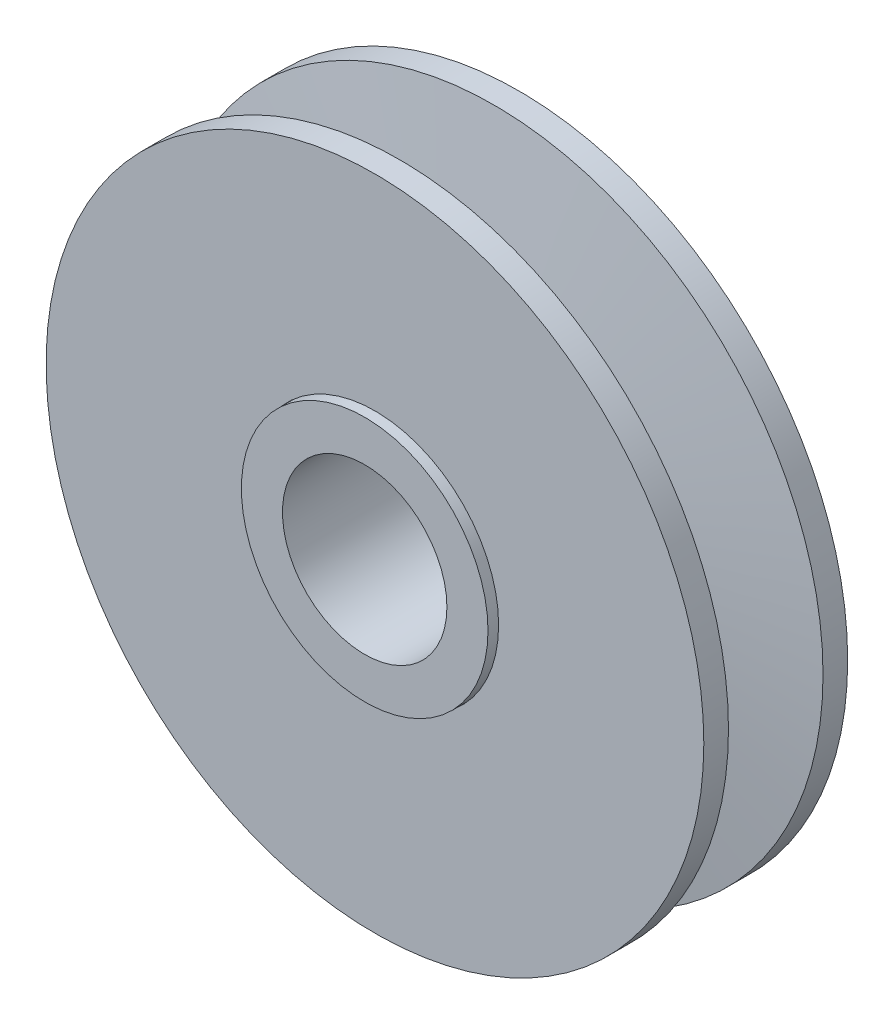
ISO-10303-21;
HEADER;
FILE_DESCRIPTION(('STEP AP214'),'2;1');
FILE_NAME('part.step','',(''),(''),'','','');
FILE_SCHEMA(('AUTOMOTIVE_DESIGN { 1 0 10303 214 1 1 1 1 }'));
ENDSEC;
DATA;
#1=APPLICATION_CONTEXT('core data for automotive mechanical design processes');
#2=APPLICATION_PROTOCOL_DEFINITION('international standard','automotive_design',2000,#1);
#3=PRODUCT_CONTEXT('',#1,'mechanical');
#4=PRODUCT('Part','Part','',(#3));
#5=PRODUCT_RELATED_PRODUCT_CATEGORY('part','',(#4));
#6=PRODUCT_DEFINITION_FORMATION('','',#4);
#7=PRODUCT_DEFINITION_CONTEXT('part definition',#1,'design');
#8=PRODUCT_DEFINITION('design','',#6,#7);
#9=PRODUCT_DEFINITION_SHAPE('','',#8);
#10=(LENGTH_UNIT() NAMED_UNIT(*) SI_UNIT(.MILLI.,.METRE.));
#11=(NAMED_UNIT(*) PLANE_ANGLE_UNIT() SI_UNIT($,.RADIAN.));
#12=(NAMED_UNIT(*) SI_UNIT($,.STERADIAN.) SOLID_ANGLE_UNIT());
#13=UNCERTAINTY_MEASURE_WITH_UNIT(LENGTH_MEASURE(1.E-05),#10,'distance_accuracy_value','');
#14=(GEOMETRIC_REPRESENTATION_CONTEXT(3) GLOBAL_UNCERTAINTY_ASSIGNED_CONTEXT((#13)) GLOBAL_UNIT_ASSIGNED_CONTEXT((#10,
#11,#12)) REPRESENTATION_CONTEXT('',''));
#15=CARTESIAN_POINT('',(0.,0.,0.));
#16=DIRECTION('',(0.,0.,1.));
#17=DIRECTION('',(1.,0.,0.));
#18=AXIS2_PLACEMENT_3D('',#15,#16,#17);
#19=CARTESIAN_POINT('',(0.,0.,0.));
#20=DIRECTION('',(0.,0.,1.));
#21=DIRECTION('',(1.,0.,0.));
#22=AXIS2_PLACEMENT_3D('',#19,#20,#21);
#23=TOROIDAL_SURFACE('',#22,15.08125,2.38125);
#24=CARTESIAN_POINT('',(0.,0.,2.36389900894278));
#25=DIRECTION('',(0.,0.,1.));
#26=DIRECTION('',(1.,0.,0.));
#27=AXIS2_PLACEMENT_3D('',#24,#25,#26);
#28=CIRCLE('',#27,14.7943126583741);
#29=CARTESIAN_POINT('',(14.7943126583741,0.,2.36389900894278));
#30=VERTEX_POINT('',#29);
#31=EDGE_CURVE('E68',#30,#30,#28,.T.);
#32=ORIENTED_EDGE('',*,*,#31,.F.);
#33=EDGE_LOOP('',(#32));
#34=FACE_BOUND('',#33,.T.);
#35=CARTESIAN_POINT('',(0.,0.,-2.36389900894278));
#36=DIRECTION('',(0.,0.,1.));
#37=DIRECTION('',(1.,0.,0.));
#38=AXIS2_PLACEMENT_3D('',#35,#36,#37);
#39=CIRCLE('',#38,14.7943126583741);
#40=CARTESIAN_POINT('',(14.7943126583741,0.,-2.36389900894278));
#41=VERTEX_POINT('',#40);
#42=EDGE_CURVE('E66',#41,#41,#39,.T.);
#43=ORIENTED_EDGE('',*,*,#42,.T.);
#44=EDGE_LOOP('',(#43));
#45=FACE_BOUND('',#44,.T.);
#46=ADVANCED_FACE('F50',(#34,#45),#23,.F.);
#47=CARTESIAN_POINT('',(0.,0.,2.36389900894278));
#48=DIRECTION('',(0.,0.,1.));
#49=DIRECTION('',(1.,0.,0.));
#50=AXIS2_PLACEMENT_3D('',#47,#48,#49);
#51=CONICAL_SURFACE('',#50,14.7943126583741,1.45000417866102);
#52=CARTESIAN_POINT('',(0.,0.,3.65125));
#53=DIRECTION('',(0.,0.,1.));
#54=DIRECTION('',(1.,0.,0.));
#55=AXIS2_PLACEMENT_3D('',#52,#53,#54);
#56=CIRCLE('',#55,25.4);
#57=CARTESIAN_POINT('',(25.4,0.,3.65125));
#58=VERTEX_POINT('',#57);
#59=EDGE_CURVE('E72',#58,#58,#56,.T.);
#60=ORIENTED_EDGE('',*,*,#59,.F.);
#61=EDGE_LOOP('',(#60));
#62=FACE_BOUND('',#61,.T.);
#63=ORIENTED_EDGE('',*,*,#31,.T.);
#64=EDGE_LOOP('',(#63));
#65=FACE_BOUND('',#64,.T.);
#66=ADVANCED_FACE('F99',(#62,#65),#51,.T.);
#67=CARTESIAN_POINT('',(0.,0.,6.35));
#68=DIRECTION('',(0.,0.,1.));
#69=DIRECTION('',(1.,0.,0.));
#70=AXIS2_PLACEMENT_3D('',#67,#68,#69);
#71=CYLINDRICAL_SURFACE('',#70,25.4);
#72=CARTESIAN_POINT('',(0.,0.,5.55625));
#73=DIRECTION('',(0.,0.,1.));
#74=DIRECTION('',(1.,0.,0.));
#75=AXIS2_PLACEMENT_3D('',#72,#73,#74);
#76=CIRCLE('',#75,25.4);
#77=CARTESIAN_POINT('',(25.4,0.,5.55625));
#78=VERTEX_POINT('',#77);
#79=EDGE_CURVE('E79',#78,#78,#76,.T.);
#80=ORIENTED_EDGE('',*,*,#79,.F.);
#81=EDGE_LOOP('',(#80));
#82=FACE_BOUND('',#81,.T.);
#83=ORIENTED_EDGE('',*,*,#59,.T.);
#84=EDGE_LOOP('',(#83));
#85=FACE_BOUND('',#84,.T.);
#86=ADVANCED_FACE('F105',(#82,#85),#71,.T.);
#87=CARTESIAN_POINT('',(0.,9.525,5.55625));
#88=DIRECTION('',(0.,0.,-1.));
#89=DIRECTION('',(-1.,0.,0.));
#90=AXIS2_PLACEMENT_3D('',#87,#88,#89);
#91=PLANE('',#90);
#92=CARTESIAN_POINT('',(0.,0.,5.55625));
#93=DIRECTION('',(0.,0.,-1.));
#94=DIRECTION('',(-1.,0.,0.));
#95=AXIS2_PLACEMENT_3D('',#92,#93,#94);
#96=CIRCLE('',#95,9.5504);
#97=CARTESIAN_POINT('',(9.5504,0.,5.55625));
#98=VERTEX_POINT('',#97);
#99=EDGE_CURVE('E54',#98,#98,#96,.T.);
#100=ORIENTED_EDGE('',*,*,#99,.T.);
#101=EDGE_LOOP('',(#100));
#102=FACE_BOUND('',#101,.T.);
#103=ORIENTED_EDGE('',*,*,#79,.T.);
#104=EDGE_LOOP('',(#103));
#105=FACE_BOUND('',#104,.T.);
#106=ADVANCED_FACE('F87',(#102,#105),#91,.F.);
#107=CARTESIAN_POINT('',(0.,25.4,-5.55625));
#108=DIRECTION('',(0.,0.,1.));
#109=DIRECTION('',(1.,0.,0.));
#110=AXIS2_PLACEMENT_3D('',#107,#108,#109);
#111=PLANE('',#110);
#112=CARTESIAN_POINT('',(0.,0.,-5.55625));
#113=DIRECTION('',(0.,0.,1.));
#114=DIRECTION('',(1.,0.,0.));
#115=AXIS2_PLACEMENT_3D('',#112,#113,#114);
#116=CIRCLE('',#115,9.5504);
#117=CARTESIAN_POINT('',(9.5504,0.,-5.55625));
#118=VERTEX_POINT('',#117);
#119=EDGE_CURVE('E63',#118,#118,#116,.T.);
#120=ORIENTED_EDGE('',*,*,#119,.T.);
#121=EDGE_LOOP('',(#120));
#122=FACE_BOUND('',#121,.T.);
#123=CARTESIAN_POINT('',(0.,0.,-5.55625));
#124=DIRECTION('',(0.,0.,1.));
#125=DIRECTION('',(1.,0.,0.));
#126=AXIS2_PLACEMENT_3D('',#123,#124,#125);
#127=CIRCLE('',#126,25.4);
#128=CARTESIAN_POINT('',(25.4,0.,-5.55625));
#129=VERTEX_POINT('',#128);
#130=EDGE_CURVE('E58',#129,#129,#127,.T.);
#131=ORIENTED_EDGE('',*,*,#130,.F.);
#132=EDGE_LOOP('',(#131));
#133=FACE_BOUND('',#132,.T.);
#134=ADVANCED_FACE('F114',(#122,#133),#111,.F.);
#135=CARTESIAN_POINT('',(0.,0.,6.35));
#136=DIRECTION('',(0.,0.,1.));
#137=DIRECTION('',(1.,0.,0.));
#138=AXIS2_PLACEMENT_3D('',#135,#136,#137);
#139=CYLINDRICAL_SURFACE('',#138,25.4);
#140=CARTESIAN_POINT('',(0.,0.,-3.65125));
#141=DIRECTION('',(0.,0.,1.));
#142=DIRECTION('',(1.,0.,0.));
#143=AXIS2_PLACEMENT_3D('',#140,#141,#142);
#144=CIRCLE('',#143,25.4);
#145=CARTESIAN_POINT('',(25.4,0.,-3.65125));
#146=VERTEX_POINT('',#145);
#147=EDGE_CURVE('E12',#146,#146,#144,.T.);
#148=ORIENTED_EDGE('',*,*,#147,.F.);
#149=EDGE_LOOP('',(#148));
#150=FACE_BOUND('',#149,.T.);
#151=ORIENTED_EDGE('',*,*,#130,.T.);
#152=EDGE_LOOP('',(#151));
#153=FACE_BOUND('',#152,.T.);
#154=ADVANCED_FACE('F95',(#150,#153),#139,.T.);
#155=CARTESIAN_POINT('',(0.,0.,-3.65125));
#156=DIRECTION('',(0.,0.,-1.));
#157=DIRECTION('',(-1.,0.,0.));
#158=AXIS2_PLACEMENT_3D('',#155,#156,#157);
#159=CONICAL_SURFACE('',#158,25.4,1.45000417866102);
#160=ORIENTED_EDGE('',*,*,#42,.F.);
#161=EDGE_LOOP('',(#160));
#162=FACE_BOUND('',#161,.T.);
#163=ORIENTED_EDGE('',*,*,#147,.T.);
#164=EDGE_LOOP('',(#163));
#165=FACE_BOUND('',#164,.T.);
#166=ADVANCED_FACE('F90',(#162,#165),#159,.T.);
#167=CARTESIAN_POINT('',(0.,0.,-6.35));
#168=DIRECTION('',(0.,0.,1.));
#169=DIRECTION('',(1.,0.,0.));
#170=AXIS2_PLACEMENT_3D('',#167,#168,#169);
#171=CYLINDRICAL_SURFACE('',#170,9.5504);
#172=CARTESIAN_POINT('',(9.5504,0.,-5.55625));
#173=CARTESIAN_POINT('',(9.5504,0.,-5.44049479166667));
#174=CARTESIAN_POINT('',(9.5504,0.,-5.32473958333333));
#175=CARTESIAN_POINT('',(9.5504,0.,-5.09322916666667));
#176=CARTESIAN_POINT('',(9.5504,0.,-4.97747395833333));
#177=CARTESIAN_POINT('',(9.5504,0.,-4.74596354166667));
#178=CARTESIAN_POINT('',(9.5504,0.,-4.63020833333333));
#179=CARTESIAN_POINT('',(9.5504,0.,-4.39869791666667));
#180=CARTESIAN_POINT('',(9.5504,0.,-4.28294270833333));
#181=CARTESIAN_POINT('',(9.5504,0.,-4.05143229166667));
#182=CARTESIAN_POINT('',(9.5504,0.,-3.93567708333333));
#183=CARTESIAN_POINT('',(9.5504,0.,-3.70416666666667));
#184=CARTESIAN_POINT('',(9.5504,0.,-3.58841145833333));
#185=CARTESIAN_POINT('',(9.5504,0.,-3.35690104166667));
#186=CARTESIAN_POINT('',(9.5504,0.,-3.24114583333333));
#187=CARTESIAN_POINT('',(9.5504,0.,-3.00963541666667));
#188=CARTESIAN_POINT('',(9.5504,0.,-2.89388020833333));
#189=CARTESIAN_POINT('',(9.5504,0.,-2.66236979166667));
#190=CARTESIAN_POINT('',(9.5504,0.,-2.54661458333333));
#191=CARTESIAN_POINT('',(9.5504,0.,-2.31510416666667));
#192=CARTESIAN_POINT('',(9.5504,0.,-2.19934895833333));
#193=CARTESIAN_POINT('',(9.5504,0.,-1.96783854166667));
#194=CARTESIAN_POINT('',(9.5504,0.,-1.85208333333333));
#195=CARTESIAN_POINT('',(9.5504,0.,-1.62057291666667));
#196=CARTESIAN_POINT('',(9.5504,0.,-1.50481770833333));
#197=CARTESIAN_POINT('',(9.5504,0.,-1.27330729166667));
#198=CARTESIAN_POINT('',(9.5504,0.,-1.15755208333333));
#199=CARTESIAN_POINT('',(9.5504,0.,-0.926041666666667));
#200=CARTESIAN_POINT('',(9.5504,0.,-0.810286458333333));
#201=CARTESIAN_POINT('',(9.5504,0.,-0.578776041666666));
#202=CARTESIAN_POINT('',(9.5504,0.,-0.463020833333333));
#203=CARTESIAN_POINT('',(9.5504,0.,-0.231510416666666));
#204=CARTESIAN_POINT('',(9.5504,0.,-0.115755208333333));
#205=CARTESIAN_POINT('',(9.5504,0.,0.115755208333334));
#206=CARTESIAN_POINT('',(9.5504,0.,0.231510416666667));
#207=CARTESIAN_POINT('',(9.5504,0.,0.463020833333334));
#208=CARTESIAN_POINT('',(9.5504,0.,0.578776041666667));
#209=CARTESIAN_POINT('',(9.5504,0.,0.810286458333333));
#210=CARTESIAN_POINT('',(9.5504,0.,0.926041666666667));
#211=CARTESIAN_POINT('',(9.5504,0.,1.15755208333333));
#212=CARTESIAN_POINT('',(9.5504,0.,1.27330729166667));
#213=CARTESIAN_POINT('',(9.5504,0.,1.50481770833333));
#214=CARTESIAN_POINT('',(9.5504,0.,1.62057291666667));
#215=CARTESIAN_POINT('',(9.5504,0.,1.85208333333333));
#216=CARTESIAN_POINT('',(9.5504,0.,1.96783854166667));
#217=CARTESIAN_POINT('',(9.5504,0.,2.19934895833333));
#218=CARTESIAN_POINT('',(9.5504,0.,2.31510416666667));
#219=CARTESIAN_POINT('',(9.5504,0.,2.54661458333333));
#220=CARTESIAN_POINT('',(9.5504,0.,2.66236979166667));
#221=CARTESIAN_POINT('',(9.5504,0.,2.89388020833333));
#222=CARTESIAN_POINT('',(9.5504,0.,3.00963541666667));
#223=CARTESIAN_POINT('',(9.5504,0.,3.24114583333333));
#224=CARTESIAN_POINT('',(9.5504,0.,3.35690104166667));
#225=CARTESIAN_POINT('',(9.5504,0.,3.58841145833333));
#226=CARTESIAN_POINT('',(9.5504,0.,3.70416666666667));
#227=CARTESIAN_POINT('',(9.5504,0.,3.93567708333333));
#228=CARTESIAN_POINT('',(9.5504,0.,4.05143229166667));
#229=CARTESIAN_POINT('',(9.5504,0.,4.28294270833333));
#230=CARTESIAN_POINT('',(9.5504,0.,4.39869791666667));
#231=CARTESIAN_POINT('',(9.5504,0.,4.63020833333333));
#232=CARTESIAN_POINT('',(9.5504,0.,4.74596354166667));
#233=CARTESIAN_POINT('',(9.5504,0.,4.97747395833333));
#234=CARTESIAN_POINT('',(9.5504,0.,5.09322916666667));
#235=CARTESIAN_POINT('',(9.5504,0.,5.32473958333333));
#236=CARTESIAN_POINT('',(9.5504,0.,5.44049479166667));
#237=CARTESIAN_POINT('',(9.5504,0.,5.55625));
#238=B_SPLINE_CURVE_WITH_KNOTS('',3,(#172,#173,#174,#175,#176,#177,#178,#179,#180,#181,#182,
#183,#184,#185,#186,#187,#188,#189,#190,#191,#192,#193,#194,#195,#196,#197,#198,#199,#200,#201,
#202,#203,#204,#205,#206,#207,#208,#209,#210,#211,#212,#213,#214,#215,#216,#217,#218,#219,#220,
#221,#222,#223,#224,#225,#226,#227,#228,#229,#230,#231,#232,#233,#234,#235,#236,#237),
.UNSPECIFIED.,.F.,.F.,(4,2,2,2,2,2,2,2,2,2,2,2,2,2,2,2,2,2,2,2,2,2,2,2,2,2,2,2,2,2,2,2,4),(0.,
0.347265625,0.694531250000001,1.041796875,1.3890625,1.736328125,2.08359375,2.430859375,2.778125,
3.125390625,3.47265625,3.819921875,4.1671875,4.514453125,4.86171875,5.208984375,5.55625,
5.903515625,6.25078125,6.598046875,6.9453125,7.292578125,7.63984375,7.987109375,8.334375,
8.681640625,9.02890625,9.376171875,9.7234375,10.070703125,10.41796875,10.765234375,11.1125),.UNSPECIFIED.);
#239=EDGE_CURVE('BSEAM52',#118,#98,#238,.T.);
#240=ORIENTED_EDGE('',*,*,#119,.F.);
#241=ORIENTED_EDGE('',*,*,#99,.F.);
#242=ORIENTED_EDGE('',*,*,#239,.T.);
#243=ORIENTED_EDGE('',*,*,#239,.F.);
#244=EDGE_LOOP('',(#240,#242,#241,#243));
#245=FACE_BOUND('',#244,.T.);
#246=ADVANCED_FACE('F52',(#245),#171,.F.);
#247=CLOSED_SHELL('',(#46,#66,#86,#106,#134,#154,#166,#246));
#248=MANIFOLD_SOLID_BREP('B2',#247);
#249=CARTESIAN_POINT('',(0.,9.525,6.35));
#250=DIRECTION('',(0.,0.,-1.));
#251=DIRECTION('',(-1.,0.,0.));
#252=AXIS2_PLACEMENT_3D('',#249,#250,#251);
#253=PLANE('',#252);
#254=CARTESIAN_POINT('',(0.,0.,6.35));
#255=DIRECTION('',(0.,0.,1.));
#256=DIRECTION('',(1.,0.,0.));
#257=AXIS2_PLACEMENT_3D('',#254,#255,#256);
#258=CIRCLE('',#257,6.35);
#259=CARTESIAN_POINT('',(6.35,0.,6.35));
#260=VERTEX_POINT('',#259);
#261=EDGE_CURVE('E177',#260,#260,#258,.T.);
#262=ORIENTED_EDGE('',*,*,#261,.F.);
#263=EDGE_LOOP('',(#262));
#264=FACE_BOUND('',#263,.T.);
#265=CARTESIAN_POINT('',(0.,0.,6.35));
#266=DIRECTION('',(0.,0.,1.));
#267=DIRECTION('',(1.,0.,0.));
#268=AXIS2_PLACEMENT_3D('',#265,#266,#267);
#269=CIRCLE('',#268,9.525);
#270=CARTESIAN_POINT('',(9.525,0.,6.35));
#271=VERTEX_POINT('',#270);
#272=EDGE_CURVE('E49',#271,#271,#269,.T.);
#273=ORIENTED_EDGE('',*,*,#272,.T.);
#274=EDGE_LOOP('',(#273));
#275=FACE_BOUND('',#274,.T.);
#276=ADVANCED_FACE('F171',(#264,#275),#253,.F.);
#277=CARTESIAN_POINT('',(0.,0.,6.35));
#278=DIRECTION('',(0.,0.,1.));
#279=DIRECTION('',(1.,0.,0.));
#280=AXIS2_PLACEMENT_3D('',#277,#278,#279);
#281=CYLINDRICAL_SURFACE('',#280,6.35);
#282=CARTESIAN_POINT('',(0.,0.,-6.35));
#283=DIRECTION('',(0.,0.,1.));
#284=DIRECTION('',(1.,0.,0.));
#285=AXIS2_PLACEMENT_3D('',#282,#283,#284);
#286=CIRCLE('',#285,6.35);
#287=CARTESIAN_POINT('',(6.35,0.,-6.35));
#288=VERTEX_POINT('',#287);
#289=EDGE_CURVE('E181',#288,#288,#286,.T.);
#290=ORIENTED_EDGE('',*,*,#289,.F.);
#291=EDGE_LOOP('',(#290));
#292=FACE_BOUND('',#291,.T.);
#293=ORIENTED_EDGE('',*,*,#261,.T.);
#294=EDGE_LOOP('',(#293));
#295=FACE_BOUND('',#294,.T.);
#296=ADVANCED_FACE('F197',(#292,#295),#281,.F.);
#297=CARTESIAN_POINT('',(0.,9.525,-6.35));
#298=DIRECTION('',(0.,0.,1.));
#299=DIRECTION('',(1.,0.,0.));
#300=AXIS2_PLACEMENT_3D('',#297,#298,#299);
#301=PLANE('',#300);
#302=CARTESIAN_POINT('',(0.,0.,-6.35));
#303=DIRECTION('',(0.,0.,1.));
#304=DIRECTION('',(1.,0.,0.));
#305=AXIS2_PLACEMENT_3D('',#302,#303,#304);
#306=CIRCLE('',#305,9.525);
#307=CARTESIAN_POINT('',(9.525,0.,-6.35));
#308=VERTEX_POINT('',#307);
#309=EDGE_CURVE('E185',#308,#308,#306,.T.);
#310=ORIENTED_EDGE('',*,*,#309,.F.);
#311=EDGE_LOOP('',(#310));
#312=FACE_BOUND('',#311,.T.);
#313=ORIENTED_EDGE('',*,*,#289,.T.);
#314=EDGE_LOOP('',(#313));
#315=FACE_BOUND('',#314,.T.);
#316=ADVANCED_FACE('F194',(#312,#315),#301,.F.);
#317=CARTESIAN_POINT('',(0.,0.,6.35));
#318=DIRECTION('',(0.,0.,1.));
#319=DIRECTION('',(1.,0.,0.));
#320=AXIS2_PLACEMENT_3D('',#317,#318,#319);
#321=CYLINDRICAL_SURFACE('',#320,9.525);
#322=ORIENTED_EDGE('',*,*,#309,.T.);
#323=EDGE_LOOP('',(#322));
#324=FACE_BOUND('',#323,.T.);
#325=ORIENTED_EDGE('',*,*,#272,.F.);
#326=EDGE_LOOP('',(#325));
#327=FACE_BOUND('',#326,.T.);
#328=ADVANCED_FACE('F191',(#324,#327),#321,.T.);
#329=CLOSED_SHELL('',(#276,#296,#316,#328));
#330=MANIFOLD_SOLID_BREP('B7',#329);
#331=ADVANCED_BREP_SHAPE_REPRESENTATION('',(#18,#248,#330),#14);
#332=SHAPE_DEFINITION_REPRESENTATION(#9,#331);
ENDSEC;
END-ISO-10303-21;
